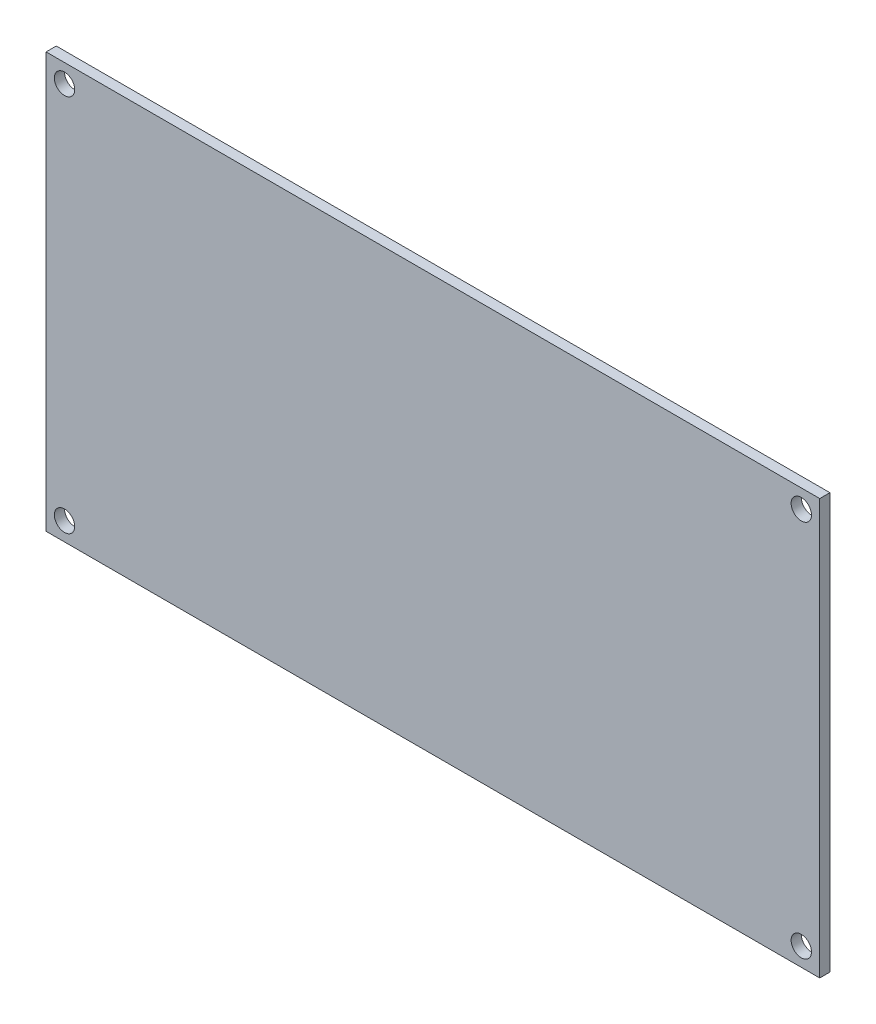
ISO-10303-21;
HEADER;
FILE_DESCRIPTION(('STEP AP214'),'2;1');
FILE_NAME('part.step','',(''),(''),'','','');
FILE_SCHEMA(('AUTOMOTIVE_DESIGN { 1 0 10303 214 1 1 1 1 }'));
ENDSEC;
DATA;
#1=APPLICATION_CONTEXT('core data for automotive mechanical design processes');
#2=APPLICATION_PROTOCOL_DEFINITION('international standard','automotive_design',2000,#1);
#3=PRODUCT_CONTEXT('',#1,'mechanical');
#4=PRODUCT('Part','Part','',(#3));
#5=PRODUCT_RELATED_PRODUCT_CATEGORY('part','',(#4));
#6=PRODUCT_DEFINITION_FORMATION('','',#4);
#7=PRODUCT_DEFINITION_CONTEXT('part definition',#1,'design');
#8=PRODUCT_DEFINITION('design','',#6,#7);
#9=PRODUCT_DEFINITION_SHAPE('','',#8);
#10=(LENGTH_UNIT() NAMED_UNIT(*) SI_UNIT(.MILLI.,.METRE.));
#11=(NAMED_UNIT(*) PLANE_ANGLE_UNIT() SI_UNIT($,.RADIAN.));
#12=(NAMED_UNIT(*) SI_UNIT($,.STERADIAN.) SOLID_ANGLE_UNIT());
#13=UNCERTAINTY_MEASURE_WITH_UNIT(LENGTH_MEASURE(1.E-05),#10,'distance_accuracy_value','');
#14=(GEOMETRIC_REPRESENTATION_CONTEXT(3) GLOBAL_UNCERTAINTY_ASSIGNED_CONTEXT((#13)) GLOBAL_UNIT_ASSIGNED_CONTEXT((#10,
#11,#12)) REPRESENTATION_CONTEXT('',''));
#15=CARTESIAN_POINT('',(0.,0.,0.));
#16=DIRECTION('',(0.,0.,1.));
#17=DIRECTION('',(1.,0.,0.));
#18=AXIS2_PLACEMENT_3D('',#15,#16,#17);
#19=CARTESIAN_POINT('',(0.,0.,2.));
#20=DIRECTION('',(0.,0.,1.));
#21=DIRECTION('',(1.,0.,0.));
#22=AXIS2_PLACEMENT_3D('',#19,#20,#21);
#23=PLANE('',#22);
#24=CARTESIAN_POINT('',(28.4861733241856,-38.0174053634021,2.));
#25=DIRECTION('',(0.,0.,1.));
#26=DIRECTION('',(1.,0.,0.));
#27=AXIS2_PLACEMENT_3D('',#24,#25,#26);
#28=CIRCLE('',#27,2.00000000000001);
#29=CARTESIAN_POINT('',(30.4861733241856,-38.0174053634021,2.));
#30=VERTEX_POINT('',#29);
#31=EDGE_CURVE('E121',#30,#30,#28,.T.);
#32=ORIENTED_EDGE('',*,*,#31,.F.);
#33=EDGE_LOOP('',(#32));
#34=FACE_BOUND('',#33,.T.);
#35=CARTESIAN_POINT('',(-116.210955208112,36.2841708057384,2.));
#36=DIRECTION('',(0.,0.,1.));
#37=DIRECTION('',(1.,0.,0.));
#38=AXIS2_PLACEMENT_3D('',#35,#36,#37);
#39=CIRCLE('',#38,2.00000000000001);
#40=CARTESIAN_POINT('',(-114.210955208112,36.2841708057384,2.));
#41=VERTEX_POINT('',#40);
#42=EDGE_CURVE('E100',#41,#41,#39,.T.);
#43=ORIENTED_EDGE('',*,*,#42,.F.);
#44=EDGE_LOOP('',(#43));
#45=FACE_BOUND('',#44,.T.);
#46=DIRECTION('',(0.,-1.,0.));
#47=VECTOR('',#46,1.);
#48=CARTESIAN_POINT('',(-119.832275551672,39.9054911492981,2.));
#49=LINE('',#48,#47);
#50=CARTESIAN_POINT('',(-119.832275551672,39.9054911492981,2.));
#51=VERTEX_POINT('',#50);
#52=CARTESIAN_POINT('',(-119.832275551672,-41.6387257069617,2.));
#53=VERTEX_POINT('',#52);
#54=EDGE_CURVE('E85',#51,#53,#49,.T.);
#55=ORIENTED_EDGE('',*,*,#54,.T.);
#56=DIRECTION('',(1.,0.,0.));
#57=VECTOR('',#56,1.);
#58=CARTESIAN_POINT('',(-119.832275551672,-41.6387257069617,2.));
#59=LINE('',#58,#57);
#60=CARTESIAN_POINT('',(32.1074936677452,-41.6387257069617,2.));
#61=VERTEX_POINT('',#60);
#62=EDGE_CURVE('E80',#53,#61,#59,.T.);
#63=ORIENTED_EDGE('',*,*,#62,.T.);
#64=DIRECTION('',(0.,1.,0.));
#65=VECTOR('',#64,1.);
#66=CARTESIAN_POINT('',(32.1074936677452,39.9054911492981,2.));
#67=LINE('',#66,#65);
#68=CARTESIAN_POINT('',(32.1074936677452,39.9054911492981,2.));
#69=VERTEX_POINT('',#68);
#70=EDGE_CURVE('E83',#61,#69,#67,.T.);
#71=ORIENTED_EDGE('',*,*,#70,.T.);
#72=DIRECTION('',(-1.,0.,0.));
#73=VECTOR('',#72,1.);
#74=CARTESIAN_POINT('',(-119.832275551672,39.9054911492981,2.));
#75=LINE('',#74,#73);
#76=EDGE_CURVE('E50',#69,#51,#75,.T.);
#77=ORIENTED_EDGE('',*,*,#76,.T.);
#78=EDGE_LOOP('',(#55,#63,#71,#77));
#79=FACE_BOUND('',#78,.T.);
#80=CARTESIAN_POINT('',(-116.210955208112,-38.0174053634021,2.));
#81=DIRECTION('',(0.,0.,1.));
#82=DIRECTION('',(1.,0.,0.));
#83=AXIS2_PLACEMENT_3D('',#80,#81,#82);
#84=CIRCLE('',#83,2.);
#85=CARTESIAN_POINT('',(-114.210955208112,-38.0174053634021,2.));
#86=VERTEX_POINT('',#85);
#87=EDGE_CURVE('E115',#86,#86,#84,.T.);
#88=ORIENTED_EDGE('',*,*,#87,.F.);
#89=EDGE_LOOP('',(#88));
#90=FACE_BOUND('',#89,.T.);
#91=CARTESIAN_POINT('',(28.4861733241856,36.2841708057384,2.));
#92=DIRECTION('',(0.,0.,1.));
#93=DIRECTION('',(1.,0.,0.));
#94=AXIS2_PLACEMENT_3D('',#91,#92,#93);
#95=CIRCLE('',#94,2.);
#96=CARTESIAN_POINT('',(30.4861733241856,36.2841708057384,2.));
#97=VERTEX_POINT('',#96);
#98=EDGE_CURVE('E127',#97,#97,#95,.T.);
#99=ORIENTED_EDGE('',*,*,#98,.F.);
#100=EDGE_LOOP('',(#99));
#101=FACE_BOUND('',#100,.T.);
#102=ADVANCED_FACE('F33',(#34,#45,#79,#90,#101),#23,.T.);
#103=CARTESIAN_POINT('',(0.,0.,0.));
#104=DIRECTION('',(0.,0.,1.));
#105=DIRECTION('',(1.,0.,0.));
#106=AXIS2_PLACEMENT_3D('',#103,#104,#105);
#107=PLANE('',#106);
#108=DIRECTION('',(0.,-1.,0.));
#109=VECTOR('',#108,1.);
#110=CARTESIAN_POINT('',(-119.832275551672,39.9054911492981,0.));
#111=LINE('',#110,#109);
#112=CARTESIAN_POINT('',(-119.832275551672,39.9054911492981,0.));
#113=VERTEX_POINT('',#112);
#114=CARTESIAN_POINT('',(-119.832275551672,-41.6387257069617,0.));
#115=VERTEX_POINT('',#114);
#116=EDGE_CURVE('E97',#113,#115,#111,.T.);
#117=ORIENTED_EDGE('',*,*,#116,.F.);
#118=DIRECTION('',(-1.,0.,0.));
#119=VECTOR('',#118,1.);
#120=CARTESIAN_POINT('',(-119.832275551672,39.9054911492981,0.));
#121=LINE('',#120,#119);
#122=CARTESIAN_POINT('',(32.1074936677452,39.9054911492981,0.));
#123=VERTEX_POINT('',#122);
#124=EDGE_CURVE('E73',#123,#113,#121,.T.);
#125=ORIENTED_EDGE('',*,*,#124,.F.);
#126=DIRECTION('',(0.,1.,0.));
#127=VECTOR('',#126,1.);
#128=CARTESIAN_POINT('',(32.1074936677452,39.9054911492981,0.));
#129=LINE('',#128,#127);
#130=CARTESIAN_POINT('',(32.1074936677452,-41.6387257069617,0.));
#131=VERTEX_POINT('',#130);
#132=EDGE_CURVE('E67',#131,#123,#129,.T.);
#133=ORIENTED_EDGE('',*,*,#132,.F.);
#134=DIRECTION('',(1.,0.,0.));
#135=VECTOR('',#134,1.);
#136=CARTESIAN_POINT('',(-119.832275551672,-41.6387257069617,0.));
#137=LINE('',#136,#135);
#138=EDGE_CURVE('E89',#115,#131,#137,.T.);
#139=ORIENTED_EDGE('',*,*,#138,.F.);
#140=EDGE_LOOP('',(#117,#125,#133,#139));
#141=FACE_BOUND('',#140,.T.);
#142=CARTESIAN_POINT('',(-116.210955208112,36.2841708057384,0.));
#143=DIRECTION('',(0.,0.,1.));
#144=DIRECTION('',(1.,0.,0.));
#145=AXIS2_PLACEMENT_3D('',#142,#143,#144);
#146=CIRCLE('',#145,2.00000000000001);
#147=CARTESIAN_POINT('',(-114.210955208112,36.2841708057384,0.));
#148=VERTEX_POINT('',#147);
#149=EDGE_CURVE('E112',#148,#148,#146,.T.);
#150=ORIENTED_EDGE('',*,*,#149,.T.);
#151=EDGE_LOOP('',(#150));
#152=FACE_BOUND('',#151,.T.);
#153=CARTESIAN_POINT('',(-116.210955208112,-38.0174053634021,0.));
#154=DIRECTION('',(0.,0.,1.));
#155=DIRECTION('',(1.,0.,0.));
#156=AXIS2_PLACEMENT_3D('',#153,#154,#155);
#157=CIRCLE('',#156,2.);
#158=CARTESIAN_POINT('',(-114.210955208112,-38.0174053634021,0.));
#159=VERTEX_POINT('',#158);
#160=EDGE_CURVE('E118',#159,#159,#157,.T.);
#161=ORIENTED_EDGE('',*,*,#160,.T.);
#162=EDGE_LOOP('',(#161));
#163=FACE_BOUND('',#162,.T.);
#164=CARTESIAN_POINT('',(28.4861733241856,-38.0174053634021,0.));
#165=DIRECTION('',(0.,0.,1.));
#166=DIRECTION('',(1.,0.,0.));
#167=AXIS2_PLACEMENT_3D('',#164,#165,#166);
#168=CIRCLE('',#167,2.00000000000001);
#169=CARTESIAN_POINT('',(30.4861733241856,-38.0174053634021,0.));
#170=VERTEX_POINT('',#169);
#171=EDGE_CURVE('E124',#170,#170,#168,.T.);
#172=ORIENTED_EDGE('',*,*,#171,.T.);
#173=EDGE_LOOP('',(#172));
#174=FACE_BOUND('',#173,.T.);
#175=CARTESIAN_POINT('',(28.4861733241856,36.2841708057384,0.));
#176=DIRECTION('',(0.,0.,1.));
#177=DIRECTION('',(1.,0.,0.));
#178=AXIS2_PLACEMENT_3D('',#175,#176,#177);
#179=CIRCLE('',#178,2.);
#180=CARTESIAN_POINT('',(30.4861733241856,36.2841708057384,0.));
#181=VERTEX_POINT('',#180);
#182=EDGE_CURVE('E130',#181,#181,#179,.T.);
#183=ORIENTED_EDGE('',*,*,#182,.T.);
#184=EDGE_LOOP('',(#183));
#185=FACE_BOUND('',#184,.T.);
#186=ADVANCED_FACE('F108',(#141,#152,#163,#174,#185),#107,.F.);
#187=CARTESIAN_POINT('',(-119.832275551672,39.9054911492981,2.));
#188=DIRECTION('',(1.,0.,0.));
#189=DIRECTION('',(0.,0.,-1.));
#190=AXIS2_PLACEMENT_3D('',#187,#188,#189);
#191=PLANE('',#190);
#192=ORIENTED_EDGE('',*,*,#116,.T.);
#193=DIRECTION('',(0.,0.,-1.));
#194=VECTOR('',#193,1.);
#195=CARTESIAN_POINT('',(-119.832275551672,-41.6387257069617,2.));
#196=LINE('',#195,#194);
#197=EDGE_CURVE('E11',#53,#115,#196,.T.);
#198=ORIENTED_EDGE('',*,*,#197,.F.);
#199=ORIENTED_EDGE('',*,*,#54,.F.);
#200=DIRECTION('',(0.,0.,-1.));
#201=VECTOR('',#200,1.);
#202=CARTESIAN_POINT('',(-119.832275551672,39.9054911492981,2.));
#203=LINE('',#202,#201);
#204=EDGE_CURVE('E93',#51,#113,#203,.T.);
#205=ORIENTED_EDGE('',*,*,#204,.T.);
#206=EDGE_LOOP('',(#192,#198,#199,#205));
#207=FACE_BOUND('',#206,.T.);
#208=ADVANCED_FACE('F35',(#207),#191,.F.);
#209=CARTESIAN_POINT('',(-119.832275551672,-41.6387257069617,2.));
#210=DIRECTION('',(0.,1.,0.));
#211=DIRECTION('',(0.,0.,1.));
#212=AXIS2_PLACEMENT_3D('',#209,#210,#211);
#213=PLANE('',#212);
#214=ORIENTED_EDGE('',*,*,#138,.T.);
#215=DIRECTION('',(0.,0.,-1.));
#216=VECTOR('',#215,1.);
#217=CARTESIAN_POINT('',(32.1074936677452,-41.6387257069617,2.));
#218=LINE('',#217,#216);
#219=EDGE_CURVE('E42',#61,#131,#218,.T.);
#220=ORIENTED_EDGE('',*,*,#219,.F.);
#221=ORIENTED_EDGE('',*,*,#62,.F.);
#222=ORIENTED_EDGE('',*,*,#197,.T.);
#223=EDGE_LOOP('',(#214,#220,#221,#222));
#224=FACE_BOUND('',#223,.T.);
#225=ADVANCED_FACE('F88',(#224),#213,.F.);
#226=CARTESIAN_POINT('',(32.1074936677452,39.9054911492981,2.));
#227=DIRECTION('',(-1.,0.,0.));
#228=DIRECTION('',(0.,0.,1.));
#229=AXIS2_PLACEMENT_3D('',#226,#227,#228);
#230=PLANE('',#229);
#231=ORIENTED_EDGE('',*,*,#132,.T.);
#232=DIRECTION('',(0.,0.,-1.));
#233=VECTOR('',#232,1.);
#234=CARTESIAN_POINT('',(32.1074936677452,39.9054911492981,2.));
#235=LINE('',#234,#233);
#236=EDGE_CURVE('E90',#69,#123,#235,.T.);
#237=ORIENTED_EDGE('',*,*,#236,.F.);
#238=ORIENTED_EDGE('',*,*,#70,.F.);
#239=ORIENTED_EDGE('',*,*,#219,.T.);
#240=EDGE_LOOP('',(#231,#237,#238,#239));
#241=FACE_BOUND('',#240,.T.);
#242=ADVANCED_FACE('F91',(#241),#230,.F.);
#243=CARTESIAN_POINT('',(-119.832275551672,39.9054911492981,2.));
#244=DIRECTION('',(0.,-1.,0.));
#245=DIRECTION('',(0.,0.,-1.));
#246=AXIS2_PLACEMENT_3D('',#243,#244,#245);
#247=PLANE('',#246);
#248=ORIENTED_EDGE('',*,*,#124,.T.);
#249=ORIENTED_EDGE('',*,*,#204,.F.);
#250=ORIENTED_EDGE('',*,*,#76,.F.);
#251=ORIENTED_EDGE('',*,*,#236,.T.);
#252=EDGE_LOOP('',(#248,#249,#250,#251));
#253=FACE_BOUND('',#252,.T.);
#254=ADVANCED_FACE('F105',(#253),#247,.F.);
#255=CARTESIAN_POINT('',(-116.210955208112,36.2841708057384,2.));
#256=DIRECTION('',(0.,0.,-1.));
#257=DIRECTION('',(-1.,0.,0.));
#258=AXIS2_PLACEMENT_3D('',#255,#256,#257);
#259=CYLINDRICAL_SURFACE('',#258,2.00000000000001);
#260=ORIENTED_EDGE('',*,*,#42,.T.);
#261=EDGE_LOOP('',(#260));
#262=FACE_BOUND('',#261,.T.);
#263=ORIENTED_EDGE('',*,*,#149,.F.);
#264=EDGE_LOOP('',(#263));
#265=FACE_BOUND('',#264,.T.);
#266=ADVANCED_FACE('F149',(#262,#265),#259,.F.);
#267=CARTESIAN_POINT('',(-116.210955208112,-38.0174053634021,2.));
#268=DIRECTION('',(0.,0.,-1.));
#269=DIRECTION('',(-1.,0.,0.));
#270=AXIS2_PLACEMENT_3D('',#267,#268,#269);
#271=CYLINDRICAL_SURFACE('',#270,2.);
#272=ORIENTED_EDGE('',*,*,#87,.T.);
#273=EDGE_LOOP('',(#272));
#274=FACE_BOUND('',#273,.T.);
#275=ORIENTED_EDGE('',*,*,#160,.F.);
#276=EDGE_LOOP('',(#275));
#277=FACE_BOUND('',#276,.T.);
#278=ADVANCED_FACE('F195',(#274,#277),#271,.F.);
#279=CARTESIAN_POINT('',(28.4861733241856,-38.0174053634021,2.));
#280=DIRECTION('',(0.,0.,-1.));
#281=DIRECTION('',(-1.,0.,0.));
#282=AXIS2_PLACEMENT_3D('',#279,#280,#281);
#283=CYLINDRICAL_SURFACE('',#282,2.00000000000001);
#284=ORIENTED_EDGE('',*,*,#31,.T.);
#285=EDGE_LOOP('',(#284));
#286=FACE_BOUND('',#285,.T.);
#287=ORIENTED_EDGE('',*,*,#171,.F.);
#288=EDGE_LOOP('',(#287));
#289=FACE_BOUND('',#288,.T.);
#290=ADVANCED_FACE('F203',(#286,#289),#283,.F.);
#291=CARTESIAN_POINT('',(28.4861733241856,36.2841708057384,2.));
#292=DIRECTION('',(0.,0.,-1.));
#293=DIRECTION('',(-1.,0.,0.));
#294=AXIS2_PLACEMENT_3D('',#291,#292,#293);
#295=CYLINDRICAL_SURFACE('',#294,2.);
#296=ORIENTED_EDGE('',*,*,#98,.T.);
#297=EDGE_LOOP('',(#296));
#298=FACE_BOUND('',#297,.T.);
#299=ORIENTED_EDGE('',*,*,#182,.F.);
#300=EDGE_LOOP('',(#299));
#301=FACE_BOUND('',#300,.T.);
#302=ADVANCED_FACE('F136',(#298,#301),#295,.F.);
#303=CLOSED_SHELL('',(#102,#186,#208,#225,#242,#254,#266,#278,#290,#302));
#304=MANIFOLD_SOLID_BREP('B2',#303);
#305=ADVANCED_BREP_SHAPE_REPRESENTATION('',(#18,#304),#14);
#306=SHAPE_DEFINITION_REPRESENTATION(#9,#305);
ENDSEC;
END-ISO-10303-21;
